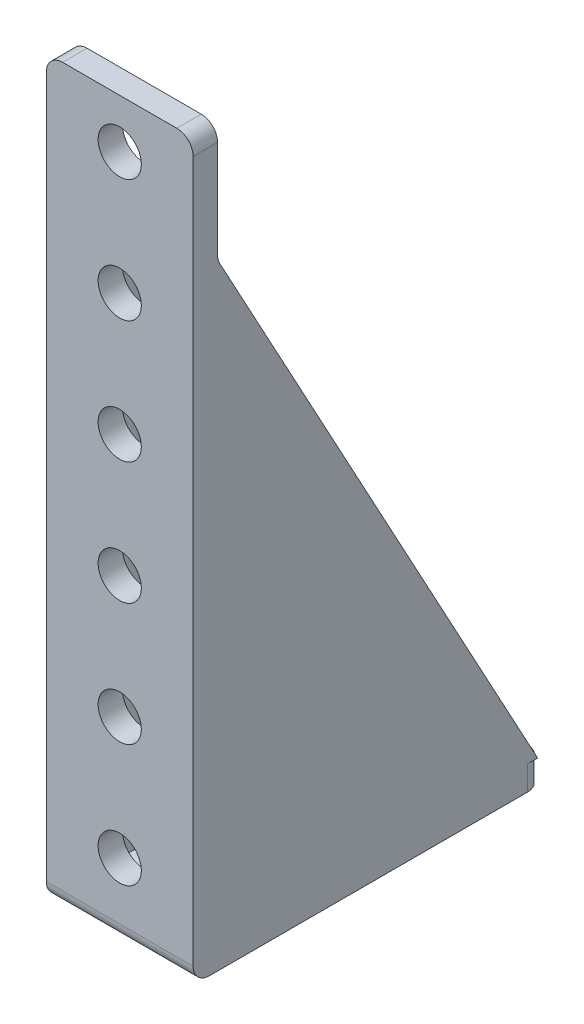
ISO-10303-21;
HEADER;
FILE_DESCRIPTION(('STEP AP214'),'2;1');
FILE_NAME('part.step','',(''),(''),'','','');
FILE_SCHEMA(('AUTOMOTIVE_DESIGN { 1 0 10303 214 1 1 1 1 }'));
ENDSEC;
DATA;
#1=APPLICATION_CONTEXT('core data for automotive mechanical design processes');
#2=APPLICATION_PROTOCOL_DEFINITION('international standard','automotive_design',2000,#1);
#3=PRODUCT_CONTEXT('',#1,'mechanical');
#4=PRODUCT('Part','Part','',(#3));
#5=PRODUCT_RELATED_PRODUCT_CATEGORY('part','',(#4));
#6=PRODUCT_DEFINITION_FORMATION('','',#4);
#7=PRODUCT_DEFINITION_CONTEXT('part definition',#1,'design');
#8=PRODUCT_DEFINITION('design','',#6,#7);
#9=PRODUCT_DEFINITION_SHAPE('','',#8);
#10=(LENGTH_UNIT() NAMED_UNIT(*) SI_UNIT(.MILLI.,.METRE.));
#11=(NAMED_UNIT(*) PLANE_ANGLE_UNIT() SI_UNIT($,.RADIAN.));
#12=(NAMED_UNIT(*) SI_UNIT($,.STERADIAN.) SOLID_ANGLE_UNIT());
#13=UNCERTAINTY_MEASURE_WITH_UNIT(LENGTH_MEASURE(1.E-05),#10,'distance_accuracy_value','');
#14=(GEOMETRIC_REPRESENTATION_CONTEXT(3) GLOBAL_UNCERTAINTY_ASSIGNED_CONTEXT((#13)) GLOBAL_UNIT_ASSIGNED_CONTEXT((#10,
#11,#12)) REPRESENTATION_CONTEXT('',''));
#15=CARTESIAN_POINT('',(0.,0.,0.));
#16=DIRECTION('',(0.,0.,1.));
#17=DIRECTION('',(1.,0.,0.));
#18=AXIS2_PLACEMENT_3D('',#15,#16,#17);
#19=CARTESIAN_POINT('',(0.,0.,0.));
#20=DIRECTION('',(0.,0.,1.));
#21=DIRECTION('',(1.,0.,0.));
#22=AXIS2_PLACEMENT_3D('',#19,#20,#21);
#23=PLANE('',#22);
#24=CARTESIAN_POINT('',(9.00000000000001,-81.,0.));
#25=DIRECTION('',(0.,0.,1.));
#26=DIRECTION('',(1.,0.,0.));
#27=AXIS2_PLACEMENT_3D('',#24,#25,#26);
#28=CIRCLE('',#27,2.65);
#29=CARTESIAN_POINT('',(11.65,-81.,0.));
#30=VERTEX_POINT('',#29);
#31=EDGE_CURVE('E283',#30,#30,#28,.T.);
#32=ORIENTED_EDGE('',*,*,#31,.T.);
#33=EDGE_LOOP('',(#32));
#34=FACE_BOUND('',#33,.T.);
#35=CARTESIAN_POINT('',(9.00000000000001,-66.,0.));
#36=DIRECTION('',(0.,0.,1.));
#37=DIRECTION('',(1.,0.,0.));
#38=AXIS2_PLACEMENT_3D('',#35,#36,#37);
#39=CIRCLE('',#38,2.65);
#40=CARTESIAN_POINT('',(11.65,-66.,0.));
#41=VERTEX_POINT('',#40);
#42=EDGE_CURVE('E294',#41,#41,#39,.T.);
#43=ORIENTED_EDGE('',*,*,#42,.T.);
#44=EDGE_LOOP('',(#43));
#45=FACE_BOUND('',#44,.T.);
#46=CARTESIAN_POINT('',(9.00000000000001,-51.,0.));
#47=DIRECTION('',(0.,0.,1.));
#48=DIRECTION('',(1.,0.,0.));
#49=AXIS2_PLACEMENT_3D('',#46,#47,#48);
#50=CIRCLE('',#49,2.65);
#51=CARTESIAN_POINT('',(11.65,-51.,0.));
#52=VERTEX_POINT('',#51);
#53=EDGE_CURVE('E296',#52,#52,#50,.T.);
#54=ORIENTED_EDGE('',*,*,#53,.T.);
#55=EDGE_LOOP('',(#54));
#56=FACE_BOUND('',#55,.T.);
#57=CARTESIAN_POINT('',(9.,-36.,0.));
#58=DIRECTION('',(0.,0.,1.));
#59=DIRECTION('',(1.,0.,0.));
#60=AXIS2_PLACEMENT_3D('',#57,#58,#59);
#61=CIRCLE('',#60,2.65);
#62=CARTESIAN_POINT('',(11.65,-36.,0.));
#63=VERTEX_POINT('',#62);
#64=EDGE_CURVE('E301',#63,#63,#61,.T.);
#65=ORIENTED_EDGE('',*,*,#64,.T.);
#66=EDGE_LOOP('',(#65));
#67=FACE_BOUND('',#66,.T.);
#68=CARTESIAN_POINT('',(9.,-21.,0.));
#69=DIRECTION('',(0.,0.,1.));
#70=DIRECTION('',(1.,0.,0.));
#71=AXIS2_PLACEMENT_3D('',#68,#69,#70);
#72=CIRCLE('',#71,2.65);
#73=CARTESIAN_POINT('',(11.65,-21.,0.));
#74=VERTEX_POINT('',#73);
#75=EDGE_CURVE('E309',#74,#74,#72,.T.);
#76=ORIENTED_EDGE('',*,*,#75,.T.);
#77=EDGE_LOOP('',(#76));
#78=FACE_BOUND('',#77,.T.);
#79=CARTESIAN_POINT('',(9.,-6.,0.));
#80=DIRECTION('',(0.,0.,1.));
#81=DIRECTION('',(1.,0.,0.));
#82=AXIS2_PLACEMENT_3D('',#79,#80,#81);
#83=CIRCLE('',#82,2.65);
#84=CARTESIAN_POINT('',(11.65,-6.,0.));
#85=VERTEX_POINT('',#84);
#86=EDGE_CURVE('E314',#85,#85,#83,.T.);
#87=ORIENTED_EDGE('',*,*,#86,.T.);
#88=EDGE_LOOP('',(#87));
#89=FACE_BOUND('',#88,.T.);
#90=DIRECTION('',(0.,1.,0.));
#91=VECTOR('',#90,1.);
#92=CARTESIAN_POINT('',(3.,-14.5,0.));
#93=LINE('',#92,#91);
#94=CARTESIAN_POINT('',(3.00000000000001,-87.,0.));
#95=VERTEX_POINT('',#94);
#96=CARTESIAN_POINT('',(3.,-13.9933455949089,0.));
#97=VERTEX_POINT('',#96);
#98=EDGE_CURVE('E65',#95,#97,#93,.T.);
#99=ORIENTED_EDGE('',*,*,#98,.T.);
#100=DIRECTION('',(-1.,0.,0.));
#101=VECTOR('',#100,1.);
#102=CARTESIAN_POINT('',(0.,-13.993345594909,0.));
#103=LINE('',#102,#101);
#104=CARTESIAN_POINT('',(0.,-13.9933455949089,0.));
#105=VERTEX_POINT('',#104);
#106=EDGE_CURVE('E404',#97,#105,#103,.T.);
#107=ORIENTED_EDGE('',*,*,#106,.T.);
#108=DIRECTION('',(0.,-1.,0.));
#109=VECTOR('',#108,1.);
#110=CARTESIAN_POINT('',(0.,0.,0.));
#111=LINE('',#110,#109);
#112=CARTESIAN_POINT('',(0.,-2.,0.));
#113=VERTEX_POINT('',#112);
#114=EDGE_CURVE('E324',#113,#105,#111,.T.);
#115=ORIENTED_EDGE('',*,*,#114,.F.);
#116=CARTESIAN_POINT('',(2.,-2.,0.));
#117=DIRECTION('',(0.,0.,1.));
#118=DIRECTION('',(1.,0.,0.));
#119=AXIS2_PLACEMENT_3D('',#116,#117,#118);
#120=CIRCLE('',#119,2.);
#121=CARTESIAN_POINT('',(2.,0.,0.));
#122=VERTEX_POINT('',#121);
#123=EDGE_CURVE('E367',#113,#122,#120,.F.);
#124=ORIENTED_EDGE('',*,*,#123,.T.);
#125=DIRECTION('',(-1.,0.,0.));
#126=VECTOR('',#125,1.);
#127=CARTESIAN_POINT('',(0.,0.,0.));
#128=LINE('',#127,#126);
#129=CARTESIAN_POINT('',(16.,0.,0.));
#130=VERTEX_POINT('',#129);
#131=EDGE_CURVE('E326',#130,#122,#128,.T.);
#132=ORIENTED_EDGE('',*,*,#131,.F.);
#133=CARTESIAN_POINT('',(16.,-2.,0.));
#134=DIRECTION('',(0.,0.,1.));
#135=DIRECTION('',(1.,0.,0.));
#136=AXIS2_PLACEMENT_3D('',#133,#134,#135);
#137=CIRCLE('',#136,2.);
#138=CARTESIAN_POINT('',(18.,-2.,0.));
#139=VERTEX_POINT('',#138);
#140=EDGE_CURVE('E366',#130,#139,#137,.F.);
#141=ORIENTED_EDGE('',*,*,#140,.T.);
#142=DIRECTION('',(0.,1.,0.));
#143=VECTOR('',#142,1.);
#144=CARTESIAN_POINT('',(18.,0.,0.));
#145=LINE('',#144,#143);
#146=CARTESIAN_POINT('',(18.,-13.9933455949089,0.));
#147=VERTEX_POINT('',#146);
#148=EDGE_CURVE('E338',#147,#139,#145,.T.);
#149=ORIENTED_EDGE('',*,*,#148,.F.);
#150=DIRECTION('',(1.,0.,0.));
#151=VECTOR('',#150,1.);
#152=CARTESIAN_POINT('',(0.,-13.9933455949089,0.));
#153=LINE('',#152,#151);
#154=CARTESIAN_POINT('',(15.,-13.9933455949089,0.));
#155=VERTEX_POINT('',#154);
#156=EDGE_CURVE('E403',#147,#155,#153,.F.);
#157=ORIENTED_EDGE('',*,*,#156,.T.);
#158=DIRECTION('',(0.,-1.,0.));
#159=VECTOR('',#158,1.);
#160=CARTESIAN_POINT('',(15.,-87.,0.));
#161=LINE('',#160,#159);
#162=CARTESIAN_POINT('',(15.,-87.,0.));
#163=VERTEX_POINT('',#162);
#164=EDGE_CURVE('E223',#155,#163,#161,.T.);
#165=ORIENTED_EDGE('',*,*,#164,.T.);
#166=DIRECTION('',(-1.,0.,0.));
#167=VECTOR('',#166,1.);
#168=CARTESIAN_POINT('',(0.,-87.,0.));
#169=LINE('',#168,#167);
#170=EDGE_CURVE('E282',#163,#95,#169,.T.);
#171=ORIENTED_EDGE('',*,*,#170,.T.);
#172=EDGE_LOOP('',(#99,#107,#115,#124,#132,#141,#149,#157,#165,#171));
#173=FACE_BOUND('',#172,.T.);
#174=ADVANCED_FACE('F39',(#34,#45,#56,#67,#78,#89,#173),#23,.F.);
#175=CARTESIAN_POINT('',(0.,-87.,0.));
#176=DIRECTION('',(0.,-1.,0.));
#177=DIRECTION('',(0.,0.,-1.));
#178=AXIS2_PLACEMENT_3D('',#175,#176,#177);
#179=PLANE('',#178);
#180=DIRECTION('',(0.,0.,1.));
#181=VECTOR('',#180,1.);
#182=CARTESIAN_POINT('',(10.6,-87.,-6.02510414656997));
#183=LINE('',#182,#181);
#184=CARTESIAN_POINT('',(10.6,-87.,-36.02510414657));
#185=VERTEX_POINT('',#184);
#186=CARTESIAN_POINT('',(10.6,-87.,-6.02510414656997));
#187=VERTEX_POINT('',#186);
#188=EDGE_CURVE('E258',#185,#187,#183,.T.);
#189=ORIENTED_EDGE('',*,*,#188,.T.);
#190=CARTESIAN_POINT('',(8.99999999999999,-87.,-6.02510414656997));
#191=DIRECTION('',(0.,-1.,0.));
#192=DIRECTION('',(0.,0.,-1.));
#193=AXIS2_PLACEMENT_3D('',#190,#191,#192);
#194=CIRCLE('',#193,1.6);
#195=CARTESIAN_POINT('',(7.39999999999999,-87.,-6.02510414656997));
#196=VERTEX_POINT('',#195);
#197=EDGE_CURVE('E249',#187,#196,#194,.T.);
#198=ORIENTED_EDGE('',*,*,#197,.T.);
#199=DIRECTION('',(0.,0.,-1.));
#200=VECTOR('',#199,1.);
#201=CARTESIAN_POINT('',(7.39999999999999,-87.,-6.02510414656997));
#202=LINE('',#201,#200);
#203=CARTESIAN_POINT('',(7.39999999999999,-87.,-36.02510414657));
#204=VERTEX_POINT('',#203);
#205=EDGE_CURVE('E248',#196,#204,#202,.T.);
#206=ORIENTED_EDGE('',*,*,#205,.T.);
#207=CARTESIAN_POINT('',(8.99999999999999,-87.,-36.02510414657));
#208=DIRECTION('',(0.,-1.,0.));
#209=DIRECTION('',(0.,0.,-1.));
#210=AXIS2_PLACEMENT_3D('',#207,#208,#209);
#211=CIRCLE('',#210,1.6);
#212=EDGE_CURVE('E251',#204,#185,#211,.T.);
#213=ORIENTED_EDGE('',*,*,#212,.T.);
#214=EDGE_LOOP('',(#189,#198,#206,#213));
#215=FACE_BOUND('',#214,.T.);
#216=DIRECTION('',(0.,0.,-1.));
#217=VECTOR('',#216,1.);
#218=CARTESIAN_POINT('',(15.,-87.,-39.2513893911399));
#219=LINE('',#218,#217);
#220=CARTESIAN_POINT('',(15.,-87.,-40.));
#221=VERTEX_POINT('',#220);
#222=EDGE_CURVE('E230',#163,#221,#219,.T.);
#223=ORIENTED_EDGE('',*,*,#222,.T.);
#224=DIRECTION('',(1.,0.,0.));
#225=VECTOR('',#224,1.);
#226=CARTESIAN_POINT('',(0.,-87.,-40.));
#227=LINE('',#226,#225);
#228=CARTESIAN_POINT('',(3.00000000000001,-87.,-40.));
#229=VERTEX_POINT('',#228);
#230=EDGE_CURVE('E285',#229,#221,#227,.T.);
#231=ORIENTED_EDGE('',*,*,#230,.F.);
#232=DIRECTION('',(0.,0.,1.));
#233=VECTOR('',#232,1.);
#234=CARTESIAN_POINT('',(3.00000000000001,-87.,0.));
#235=LINE('',#234,#233);
#236=EDGE_CURVE('E236',#229,#95,#235,.T.);
#237=ORIENTED_EDGE('',*,*,#236,.T.);
#238=ORIENTED_EDGE('',*,*,#170,.F.);
#239=EDGE_LOOP('',(#223,#231,#237,#238));
#240=FACE_BOUND('',#239,.T.);
#241=ADVANCED_FACE('F457',(#215,#240),#179,.F.);
#242=CARTESIAN_POINT('',(0.,0.,3.));
#243=DIRECTION('',(0.,0.,1.));
#244=DIRECTION('',(1.,0.,0.));
#245=AXIS2_PLACEMENT_3D('',#242,#243,#244);
#246=PLANE('',#245);
#247=CARTESIAN_POINT('',(9.00000000000001,-66.,3.));
#248=DIRECTION('',(0.,0.,1.));
#249=DIRECTION('',(1.,0.,0.));
#250=AXIS2_PLACEMENT_3D('',#247,#248,#249);
#251=CIRCLE('',#250,2.65);
#252=CARTESIAN_POINT('',(11.65,-66.,3.));
#253=VERTEX_POINT('',#252);
#254=EDGE_CURVE('E293',#253,#253,#251,.T.);
#255=ORIENTED_EDGE('',*,*,#254,.F.);
#256=EDGE_LOOP('',(#255));
#257=FACE_BOUND('',#256,.T.);
#258=CARTESIAN_POINT('',(9.,-36.,3.));
#259=DIRECTION('',(0.,0.,1.));
#260=DIRECTION('',(1.,0.,0.));
#261=AXIS2_PLACEMENT_3D('',#258,#259,#260);
#262=CIRCLE('',#261,2.65);
#263=CARTESIAN_POINT('',(11.65,-36.,3.));
#264=VERTEX_POINT('',#263);
#265=EDGE_CURVE('E307',#264,#264,#262,.T.);
#266=ORIENTED_EDGE('',*,*,#265,.F.);
#267=EDGE_LOOP('',(#266));
#268=FACE_BOUND('',#267,.T.);
#269=CARTESIAN_POINT('',(9.,-6.,3.));
#270=DIRECTION('',(0.,0.,1.));
#271=DIRECTION('',(1.,0.,0.));
#272=AXIS2_PLACEMENT_3D('',#269,#270,#271);
#273=CIRCLE('',#272,2.65);
#274=CARTESIAN_POINT('',(11.65,-6.,3.));
#275=VERTEX_POINT('',#274);
#276=EDGE_CURVE('E320',#275,#275,#273,.T.);
#277=ORIENTED_EDGE('',*,*,#276,.F.);
#278=EDGE_LOOP('',(#277));
#279=FACE_BOUND('',#278,.T.);
#280=DIRECTION('',(0.,-1.,0.));
#281=VECTOR('',#280,1.);
#282=CARTESIAN_POINT('',(0.,0.,3.));
#283=LINE('',#282,#281);
#284=CARTESIAN_POINT('',(0.,-2.,3.));
#285=VERTEX_POINT('',#284);
#286=CARTESIAN_POINT('',(0.,-88.,3.));
#287=VERTEX_POINT('',#286);
#288=EDGE_CURVE('E323',#285,#287,#283,.T.);
#289=ORIENTED_EDGE('',*,*,#288,.T.);
#290=DIRECTION('',(1.,0.,0.));
#291=VECTOR('',#290,1.);
#292=CARTESIAN_POINT('',(18.,-88.,3.));
#293=LINE('',#292,#291);
#294=CARTESIAN_POINT('',(18.,-88.,3.));
#295=VERTEX_POINT('',#294);
#296=EDGE_CURVE('E382',#287,#295,#293,.T.);
#297=ORIENTED_EDGE('',*,*,#296,.T.);
#298=DIRECTION('',(0.,1.,0.));
#299=VECTOR('',#298,1.);
#300=CARTESIAN_POINT('',(18.,0.,3.));
#301=LINE('',#300,#299);
#302=CARTESIAN_POINT('',(18.,-2.,3.));
#303=VERTEX_POINT('',#302);
#304=EDGE_CURVE('E330',#295,#303,#301,.T.);
#305=ORIENTED_EDGE('',*,*,#304,.T.);
#306=CARTESIAN_POINT('',(16.,-2.,3.));
#307=DIRECTION('',(0.,0.,1.));
#308=DIRECTION('',(1.,0.,0.));
#309=AXIS2_PLACEMENT_3D('',#306,#307,#308);
#310=CIRCLE('',#309,2.);
#311=CARTESIAN_POINT('',(16.,0.,3.));
#312=VERTEX_POINT('',#311);
#313=EDGE_CURVE('E380',#303,#312,#310,.T.);
#314=ORIENTED_EDGE('',*,*,#313,.T.);
#315=DIRECTION('',(-1.,0.,0.));
#316=VECTOR('',#315,1.);
#317=CARTESIAN_POINT('',(0.,0.,3.));
#318=LINE('',#317,#316);
#319=CARTESIAN_POINT('',(2.,0.,3.));
#320=VERTEX_POINT('',#319);
#321=EDGE_CURVE('E327',#312,#320,#318,.T.);
#322=ORIENTED_EDGE('',*,*,#321,.T.);
#323=CARTESIAN_POINT('',(2.,-2.,3.));
#324=DIRECTION('',(0.,0.,1.));
#325=DIRECTION('',(1.,0.,0.));
#326=AXIS2_PLACEMENT_3D('',#323,#324,#325);
#327=CIRCLE('',#326,2.);
#328=EDGE_CURVE('E379',#320,#285,#327,.T.);
#329=ORIENTED_EDGE('',*,*,#328,.T.);
#330=EDGE_LOOP('',(#289,#297,#305,#314,#322,#329));
#331=FACE_BOUND('',#330,.T.);
#332=CARTESIAN_POINT('',(9.,-21.,3.));
#333=DIRECTION('',(0.,0.,1.));
#334=DIRECTION('',(1.,0.,0.));
#335=AXIS2_PLACEMENT_3D('',#332,#333,#334);
#336=CIRCLE('',#335,2.65);
#337=CARTESIAN_POINT('',(11.65,-21.,3.));
#338=VERTEX_POINT('',#337);
#339=EDGE_CURVE('E315',#338,#338,#336,.T.);
#340=ORIENTED_EDGE('',*,*,#339,.F.);
#341=EDGE_LOOP('',(#340));
#342=FACE_BOUND('',#341,.T.);
#343=CARTESIAN_POINT('',(9.00000000000001,-51.,3.));
#344=DIRECTION('',(0.,0.,1.));
#345=DIRECTION('',(1.,0.,0.));
#346=AXIS2_PLACEMENT_3D('',#343,#344,#345);
#347=CIRCLE('',#346,2.65);
#348=CARTESIAN_POINT('',(11.65,-51.,3.));
#349=VERTEX_POINT('',#348);
#350=EDGE_CURVE('E297',#349,#349,#347,.T.);
#351=ORIENTED_EDGE('',*,*,#350,.F.);
#352=EDGE_LOOP('',(#351));
#353=FACE_BOUND('',#352,.T.);
#354=CARTESIAN_POINT('',(9.00000000000001,-81.,3.));
#355=DIRECTION('',(0.,0.,1.));
#356=DIRECTION('',(1.,0.,0.));
#357=AXIS2_PLACEMENT_3D('',#354,#355,#356);
#358=CIRCLE('',#357,2.65);
#359=CARTESIAN_POINT('',(11.65,-81.,3.));
#360=VERTEX_POINT('',#359);
#361=EDGE_CURVE('E287',#360,#360,#358,.T.);
#362=ORIENTED_EDGE('',*,*,#361,.F.);
#363=EDGE_LOOP('',(#362));
#364=FACE_BOUND('',#363,.T.);
#365=ADVANCED_FACE('F462',(#257,#268,#279,#331,#342,#353,#364),#246,.T.);
#366=CARTESIAN_POINT('',(0.,0.,3.));
#367=DIRECTION('',(1.,0.,0.));
#368=DIRECTION('',(0.,1.,0.));
#369=AXIS2_PLACEMENT_3D('',#366,#367,#368);
#370=PLANE('',#369);
#371=DIRECTION('',(0.,0.,-1.));
#372=VECTOR('',#371,1.);
#373=CARTESIAN_POINT('',(0.,-90.,3.));
#374=LINE('',#373,#372);
#375=CARTESIAN_POINT('',(0.,-90.,1.));
#376=VERTEX_POINT('',#375);
#377=CARTESIAN_POINT('',(0.,-90.,-38.));
#378=VERTEX_POINT('',#377);
#379=EDGE_CURVE('E341',#376,#378,#374,.T.);
#380=ORIENTED_EDGE('',*,*,#379,.F.);
#381=CARTESIAN_POINT('',(0.,-88.,1.));
#382=DIRECTION('',(1.,0.,0.));
#383=DIRECTION('',(0.,1.,0.));
#384=AXIS2_PLACEMENT_3D('',#381,#382,#383);
#385=CIRCLE('',#384,2.);
#386=EDGE_CURVE('E387',#376,#287,#385,.F.);
#387=ORIENTED_EDGE('',*,*,#386,.T.);
#388=ORIENTED_EDGE('',*,*,#288,.F.);
#389=DIRECTION('',(0.,0.,-1.));
#390=VECTOR('',#389,1.);
#391=CARTESIAN_POINT('',(0.,-2.,3.));
#392=LINE('',#391,#390);
#393=EDGE_CURVE('E361',#285,#113,#392,.T.);
#394=ORIENTED_EDGE('',*,*,#393,.T.);
#395=ORIENTED_EDGE('',*,*,#114,.T.);
#396=CARTESIAN_POINT('',(0.,-13.993345594909,-2.));
#397=DIRECTION('',(1.,0.,0.));
#398=DIRECTION('',(0.,1.,0.));
#399=AXIS2_PLACEMENT_3D('',#396,#397,#398);
#400=CIRCLE('',#399,2.);
#401=CARTESIAN_POINT('',(0.,-14.9455471810514,-0.241218564076873));
#402=VERTEX_POINT('',#401);
#403=EDGE_CURVE('E588',#105,#402,#400,.T.);
#404=ORIENTED_EDGE('',*,*,#403,.T.);
#405=DIRECTION('',(0.,-0.879390717961564,-0.47610079307122));
#406=VECTOR('',#405,1.);
#407=CARTESIAN_POINT('',(0.,-14.5,0.));
#408=LINE('',#407,#406);
#409=CARTESIAN_POINT('',(0.,-87.,-39.2513893911399));
#410=VERTEX_POINT('',#409);
#411=EDGE_CURVE('E209',#402,#410,#408,.T.);
#412=ORIENTED_EDGE('',*,*,#411,.T.);
#413=DIRECTION('',(0.,0.,1.));
#414=VECTOR('',#413,1.);
#415=CARTESIAN_POINT('',(0.,-87.,0.));
#416=LINE('',#415,#414);
#417=CARTESIAN_POINT('',(0.,-87.,-38.));
#418=VERTEX_POINT('',#417);
#419=EDGE_CURVE('E231',#410,#418,#416,.T.);
#420=ORIENTED_EDGE('',*,*,#419,.T.);
#421=DIRECTION('',(0.,-1.,0.));
#422=VECTOR('',#421,1.);
#423=CARTESIAN_POINT('',(0.,-90.,-38.));
#424=LINE('',#423,#422);
#425=EDGE_CURVE('E363',#418,#378,#424,.T.);
#426=ORIENTED_EDGE('',*,*,#425,.T.);
#427=EDGE_LOOP('',(#380,#387,#388,#394,#395,#404,#412,#420,#426));
#428=FACE_BOUND('',#427,.T.);
#429=ADVANCED_FACE('F430',(#428),#370,.F.);
#430=CARTESIAN_POINT('',(0.,-90.,3.));
#431=DIRECTION('',(0.,1.,0.));
#432=DIRECTION('',(0.,0.,1.));
#433=AXIS2_PLACEMENT_3D('',#430,#431,#432);
#434=PLANE('',#433);
#435=DIRECTION('',(0.,0.,-1.));
#436=VECTOR('',#435,1.);
#437=CARTESIAN_POINT('',(18.,-90.,3.));
#438=LINE('',#437,#436);
#439=CARTESIAN_POINT('',(18.,-90.,1.));
#440=VERTEX_POINT('',#439);
#441=CARTESIAN_POINT('',(18.,-90.,-38.));
#442=VERTEX_POINT('',#441);
#443=EDGE_CURVE('E331',#440,#442,#438,.T.);
#444=ORIENTED_EDGE('',*,*,#443,.F.);
#445=DIRECTION('',(1.,0.,0.));
#446=VECTOR('',#445,1.);
#447=CARTESIAN_POINT('',(0.,-90.,1.));
#448=LINE('',#447,#446);
#449=EDGE_CURVE('E386',#440,#376,#448,.F.);
#450=ORIENTED_EDGE('',*,*,#449,.T.);
#451=ORIENTED_EDGE('',*,*,#379,.T.);
#452=CARTESIAN_POINT('',(2.00000000000001,-90.,-38.));
#453=DIRECTION('',(0.,1.,0.));
#454=DIRECTION('',(0.,0.,1.));
#455=AXIS2_PLACEMENT_3D('',#452,#453,#454);
#456=CIRCLE('',#455,2.);
#457=CARTESIAN_POINT('',(2.00000000000001,-90.,-40.));
#458=VERTEX_POINT('',#457);
#459=EDGE_CURVE('E347',#378,#458,#456,.F.);
#460=ORIENTED_EDGE('',*,*,#459,.T.);
#461=DIRECTION('',(1.,0.,0.));
#462=VECTOR('',#461,1.);
#463=CARTESIAN_POINT('',(0.,-90.,-40.));
#464=LINE('',#463,#462);
#465=CARTESIAN_POINT('',(16.,-90.,-40.));
#466=VERTEX_POINT('',#465);
#467=EDGE_CURVE('E271',#458,#466,#464,.T.);
#468=ORIENTED_EDGE('',*,*,#467,.T.);
#469=CARTESIAN_POINT('',(16.,-90.,-38.));
#470=DIRECTION('',(0.,1.,0.));
#471=DIRECTION('',(0.,0.,1.));
#472=AXIS2_PLACEMENT_3D('',#469,#470,#471);
#473=CIRCLE('',#472,2.);
#474=EDGE_CURVE('E351',#466,#442,#473,.F.);
#475=ORIENTED_EDGE('',*,*,#474,.T.);
#476=EDGE_LOOP('',(#444,#450,#451,#460,#468,#475));
#477=FACE_BOUND('',#476,.T.);
#478=CARTESIAN_POINT('',(8.99999999999999,-90.,-6.02510414656997));
#479=DIRECTION('',(0.,-1.,0.));
#480=DIRECTION('',(0.,0.,-1.));
#481=AXIS2_PLACEMENT_3D('',#478,#479,#480);
#482=CIRCLE('',#481,1.6);
#483=CARTESIAN_POINT('',(10.6,-90.,-6.02510414656997));
#484=VERTEX_POINT('',#483);
#485=CARTESIAN_POINT('',(7.39999999999999,-90.,-6.02510414656997));
#486=VERTEX_POINT('',#485);
#487=EDGE_CURVE('E242',#484,#486,#482,.T.);
#488=ORIENTED_EDGE('',*,*,#487,.F.);
#489=DIRECTION('',(0.,0.,1.));
#490=VECTOR('',#489,1.);
#491=CARTESIAN_POINT('',(10.6,-90.,-6.02510414656997));
#492=LINE('',#491,#490);
#493=CARTESIAN_POINT('',(10.6,-90.,-36.02510414657));
#494=VERTEX_POINT('',#493);
#495=EDGE_CURVE('E247',#494,#484,#492,.T.);
#496=ORIENTED_EDGE('',*,*,#495,.F.);
#497=CARTESIAN_POINT('',(8.99999999999999,-90.,-36.02510414657));
#498=DIRECTION('',(0.,-1.,0.));
#499=DIRECTION('',(0.,0.,-1.));
#500=AXIS2_PLACEMENT_3D('',#497,#498,#499);
#501=CIRCLE('',#500,1.6);
#502=CARTESIAN_POINT('',(7.39999999999999,-90.,-36.02510414657));
#503=VERTEX_POINT('',#502);
#504=EDGE_CURVE('E264',#503,#494,#501,.T.);
#505=ORIENTED_EDGE('',*,*,#504,.F.);
#506=DIRECTION('',(0.,0.,-1.));
#507=VECTOR('',#506,1.);
#508=CARTESIAN_POINT('',(7.39999999999999,-90.,-6.02510414656997));
#509=LINE('',#508,#507);
#510=EDGE_CURVE('E263',#486,#503,#509,.T.);
#511=ORIENTED_EDGE('',*,*,#510,.F.);
#512=EDGE_LOOP('',(#488,#496,#505,#511));
#513=FACE_BOUND('',#512,.T.);
#514=ADVANCED_FACE('F478',(#477,#513),#434,.F.);
#515=CARTESIAN_POINT('',(18.,0.,3.));
#516=DIRECTION('',(-1.,0.,0.));
#517=DIRECTION('',(0.,-1.,0.));
#518=AXIS2_PLACEMENT_3D('',#515,#516,#517);
#519=PLANE('',#518);
#520=ORIENTED_EDGE('',*,*,#304,.F.);
#521=CARTESIAN_POINT('',(18.,-88.,1.));
#522=DIRECTION('',(-1.,0.,0.));
#523=DIRECTION('',(0.,-1.,0.));
#524=AXIS2_PLACEMENT_3D('',#521,#522,#523);
#525=CIRCLE('',#524,2.);
#526=EDGE_CURVE('E384',#295,#440,#525,.F.);
#527=ORIENTED_EDGE('',*,*,#526,.T.);
#528=ORIENTED_EDGE('',*,*,#443,.T.);
#529=DIRECTION('',(0.,-1.,0.));
#530=VECTOR('',#529,1.);
#531=CARTESIAN_POINT('',(18.,-87.,-38.));
#532=LINE('',#531,#530);
#533=CARTESIAN_POINT('',(18.,-87.,-38.));
#534=VERTEX_POINT('',#533);
#535=EDGE_CURVE('E216',#442,#534,#532,.F.);
#536=ORIENTED_EDGE('',*,*,#535,.T.);
#537=DIRECTION('',(0.,0.,-1.));
#538=VECTOR('',#537,1.);
#539=CARTESIAN_POINT('',(18.,-87.,-39.2513893911399));
#540=LINE('',#539,#538);
#541=CARTESIAN_POINT('',(18.,-87.,-39.2513893911399));
#542=VERTEX_POINT('',#541);
#543=EDGE_CURVE('E202',#534,#542,#540,.T.);
#544=ORIENTED_EDGE('',*,*,#543,.T.);
#545=DIRECTION('',(0.,0.879390717961564,0.47610079307122));
#546=VECTOR('',#545,1.);
#547=CARTESIAN_POINT('',(18.,-14.5,0.));
#548=LINE('',#547,#546);
#549=CARTESIAN_POINT('',(18.,-14.9455471810514,-0.241218564076872));
#550=VERTEX_POINT('',#549);
#551=EDGE_CURVE('E214',#542,#550,#548,.T.);
#552=ORIENTED_EDGE('',*,*,#551,.T.);
#553=CARTESIAN_POINT('',(18.,-13.9933455949089,-2.));
#554=DIRECTION('',(-1.,0.,0.));
#555=DIRECTION('',(0.,-1.,0.));
#556=AXIS2_PLACEMENT_3D('',#553,#554,#555);
#557=CIRCLE('',#556,2.);
#558=EDGE_CURVE('E50',#550,#147,#557,.T.);
#559=ORIENTED_EDGE('',*,*,#558,.T.);
#560=ORIENTED_EDGE('',*,*,#148,.T.);
#561=DIRECTION('',(0.,0.,-1.));
#562=VECTOR('',#561,1.);
#563=CARTESIAN_POINT('',(18.,-2.,3.));
#564=LINE('',#563,#562);
#565=EDGE_CURVE('E353',#139,#303,#564,.F.);
#566=ORIENTED_EDGE('',*,*,#565,.T.);
#567=EDGE_LOOP('',(#520,#527,#528,#536,#544,#552,#559,#560,#566));
#568=FACE_BOUND('',#567,.T.);
#569=ADVANCED_FACE('F213',(#568),#519,.F.);
#570=CARTESIAN_POINT('',(0.,0.,3.));
#571=DIRECTION('',(0.,-1.,0.));
#572=DIRECTION('',(0.,0.,-1.));
#573=AXIS2_PLACEMENT_3D('',#570,#571,#572);
#574=PLANE('',#573);
#575=ORIENTED_EDGE('',*,*,#131,.T.);
#576=DIRECTION('',(0.,0.,-1.));
#577=VECTOR('',#576,1.);
#578=CARTESIAN_POINT('',(2.,0.,3.));
#579=LINE('',#578,#577);
#580=EDGE_CURVE('E372',#122,#320,#579,.F.);
#581=ORIENTED_EDGE('',*,*,#580,.T.);
#582=ORIENTED_EDGE('',*,*,#321,.F.);
#583=DIRECTION('',(0.,0.,-1.));
#584=VECTOR('',#583,1.);
#585=CARTESIAN_POINT('',(16.,0.,3.));
#586=LINE('',#585,#584);
#587=EDGE_CURVE('E371',#312,#130,#586,.T.);
#588=ORIENTED_EDGE('',*,*,#587,.T.);
#589=EDGE_LOOP('',(#575,#581,#582,#588));
#590=FACE_BOUND('',#589,.T.);
#591=ADVANCED_FACE('F467',(#590),#574,.F.);
#592=CARTESIAN_POINT('',(9.,-6.,3.));
#593=DIRECTION('',(0.,0.,-1.));
#594=DIRECTION('',(-1.,0.,0.));
#595=AXIS2_PLACEMENT_3D('',#592,#593,#594);
#596=CYLINDRICAL_SURFACE('',#595,2.65);
#597=ORIENTED_EDGE('',*,*,#276,.T.);
#598=EDGE_LOOP('',(#597));
#599=FACE_BOUND('',#598,.T.);
#600=ORIENTED_EDGE('',*,*,#86,.F.);
#601=EDGE_LOOP('',(#600));
#602=FACE_BOUND('',#601,.T.);
#603=ADVANCED_FACE('F475',(#599,#602),#596,.F.);
#604=CARTESIAN_POINT('',(9.,-21.,3.));
#605=DIRECTION('',(0.,0.,-1.));
#606=DIRECTION('',(-1.,0.,0.));
#607=AXIS2_PLACEMENT_3D('',#604,#605,#606);
#608=CYLINDRICAL_SURFACE('',#607,2.65);
#609=ORIENTED_EDGE('',*,*,#339,.T.);
#610=EDGE_LOOP('',(#609));
#611=FACE_BOUND('',#610,.T.);
#612=ORIENTED_EDGE('',*,*,#75,.F.);
#613=EDGE_LOOP('',(#612));
#614=FACE_BOUND('',#613,.T.);
#615=ADVANCED_FACE('F531',(#611,#614),#608,.F.);
#616=CARTESIAN_POINT('',(9.,-36.,3.));
#617=DIRECTION('',(0.,0.,-1.));
#618=DIRECTION('',(-1.,0.,0.));
#619=AXIS2_PLACEMENT_3D('',#616,#617,#618);
#620=CYLINDRICAL_SURFACE('',#619,2.65);
#621=ORIENTED_EDGE('',*,*,#265,.T.);
#622=EDGE_LOOP('',(#621));
#623=FACE_BOUND('',#622,.T.);
#624=ORIENTED_EDGE('',*,*,#64,.F.);
#625=EDGE_LOOP('',(#624));
#626=FACE_BOUND('',#625,.T.);
#627=ADVANCED_FACE('F529',(#623,#626),#620,.F.);
#628=CARTESIAN_POINT('',(9.00000000000001,-51.,3.));
#629=DIRECTION('',(0.,0.,-1.));
#630=DIRECTION('',(-1.,0.,0.));
#631=AXIS2_PLACEMENT_3D('',#628,#629,#630);
#632=CYLINDRICAL_SURFACE('',#631,2.65);
#633=ORIENTED_EDGE('',*,*,#350,.T.);
#634=EDGE_LOOP('',(#633));
#635=FACE_BOUND('',#634,.T.);
#636=ORIENTED_EDGE('',*,*,#53,.F.);
#637=EDGE_LOOP('',(#636));
#638=FACE_BOUND('',#637,.T.);
#639=ADVANCED_FACE('F522',(#635,#638),#632,.F.);
#640=CARTESIAN_POINT('',(9.00000000000001,-66.,3.));
#641=DIRECTION('',(0.,0.,-1.));
#642=DIRECTION('',(-1.,0.,0.));
#643=AXIS2_PLACEMENT_3D('',#640,#641,#642);
#644=CYLINDRICAL_SURFACE('',#643,2.65);
#645=ORIENTED_EDGE('',*,*,#254,.T.);
#646=EDGE_LOOP('',(#645));
#647=FACE_BOUND('',#646,.T.);
#648=ORIENTED_EDGE('',*,*,#42,.F.);
#649=EDGE_LOOP('',(#648));
#650=FACE_BOUND('',#649,.T.);
#651=ADVANCED_FACE('F524',(#647,#650),#644,.F.);
#652=CARTESIAN_POINT('',(9.00000000000001,-81.,3.));
#653=DIRECTION('',(0.,0.,-1.));
#654=DIRECTION('',(-1.,0.,0.));
#655=AXIS2_PLACEMENT_3D('',#652,#653,#654);
#656=CYLINDRICAL_SURFACE('',#655,2.65);
#657=ORIENTED_EDGE('',*,*,#361,.T.);
#658=EDGE_LOOP('',(#657));
#659=FACE_BOUND('',#658,.T.);
#660=ORIENTED_EDGE('',*,*,#31,.F.);
#661=EDGE_LOOP('',(#660));
#662=FACE_BOUND('',#661,.T.);
#663=ADVANCED_FACE('F516',(#659,#662),#656,.F.);
#664=CARTESIAN_POINT('',(0.,-87.,-40.));
#665=DIRECTION('',(0.,0.,-1.));
#666=DIRECTION('',(-1.,0.,0.));
#667=AXIS2_PLACEMENT_3D('',#664,#665,#666);
#668=PLANE('',#667);
#669=CARTESIAN_POINT('',(2.00000000000001,-87.,-40.));
#670=VERTEX_POINT('',#669);
#671=EDGE_CURVE('E277',#670,#229,#227,.T.);
#672=ORIENTED_EDGE('',*,*,#671,.T.);
#673=ORIENTED_EDGE('',*,*,#230,.T.);
#674=CARTESIAN_POINT('',(16.,-87.,-40.));
#675=VERTEX_POINT('',#674);
#676=EDGE_CURVE('E284',#221,#675,#227,.T.);
#677=ORIENTED_EDGE('',*,*,#676,.T.);
#678=DIRECTION('',(0.,-1.,0.));
#679=VECTOR('',#678,1.);
#680=CARTESIAN_POINT('',(16.,-90.,-40.));
#681=LINE('',#680,#679);
#682=EDGE_CURVE('E346',#675,#466,#681,.T.);
#683=ORIENTED_EDGE('',*,*,#682,.T.);
#684=ORIENTED_EDGE('',*,*,#467,.F.);
#685=DIRECTION('',(0.,-1.,0.));
#686=VECTOR('',#685,1.);
#687=CARTESIAN_POINT('',(2.00000000000001,-87.,-40.));
#688=LINE('',#687,#686);
#689=EDGE_CURVE('E343',#458,#670,#688,.F.);
#690=ORIENTED_EDGE('',*,*,#689,.T.);
#691=EDGE_LOOP('',(#672,#673,#677,#683,#684,#690));
#692=FACE_BOUND('',#691,.T.);
#693=ADVANCED_FACE('F512',(#692),#668,.T.);
#694=CARTESIAN_POINT('',(8.99999999999999,-87.,-6.02510414656997));
#695=DIRECTION('',(0.,-1.,0.));
#696=DIRECTION('',(0.,0.,-1.));
#697=AXIS2_PLACEMENT_3D('',#694,#695,#696);
#698=CYLINDRICAL_SURFACE('',#697,1.6);
#699=ORIENTED_EDGE('',*,*,#487,.T.);
#700=DIRECTION('',(0.,-1.,0.));
#701=VECTOR('',#700,1.);
#702=CARTESIAN_POINT('',(7.39999999999999,-87.,-6.02510414656997));
#703=LINE('',#702,#701);
#704=EDGE_CURVE('E260',#196,#486,#703,.T.);
#705=ORIENTED_EDGE('',*,*,#704,.F.);
#706=ORIENTED_EDGE('',*,*,#197,.F.);
#707=DIRECTION('',(0.,-1.,0.));
#708=VECTOR('',#707,1.);
#709=CARTESIAN_POINT('',(10.6,-87.,-6.02510414656997));
#710=LINE('',#709,#708);
#711=EDGE_CURVE('E267',#187,#484,#710,.T.);
#712=ORIENTED_EDGE('',*,*,#711,.T.);
#713=EDGE_LOOP('',(#699,#705,#706,#712));
#714=FACE_BOUND('',#713,.T.);
#715=ADVANCED_FACE('F491',(#714),#698,.F.);
#716=CARTESIAN_POINT('',(10.6,-87.,-6.02510414656997));
#717=DIRECTION('',(1.,0.,0.));
#718=DIRECTION('',(0.,0.,-1.));
#719=AXIS2_PLACEMENT_3D('',#716,#717,#718);
#720=PLANE('',#719);
#721=ORIENTED_EDGE('',*,*,#495,.T.);
#722=ORIENTED_EDGE('',*,*,#711,.F.);
#723=ORIENTED_EDGE('',*,*,#188,.F.);
#724=DIRECTION('',(0.,-1.,0.));
#725=VECTOR('',#724,1.);
#726=CARTESIAN_POINT('',(10.6,-87.,-36.02510414657));
#727=LINE('',#726,#725);
#728=EDGE_CURVE('E275',#185,#494,#727,.T.);
#729=ORIENTED_EDGE('',*,*,#728,.T.);
#730=EDGE_LOOP('',(#721,#722,#723,#729));
#731=FACE_BOUND('',#730,.T.);
#732=ADVANCED_FACE('F497',(#731),#720,.F.);
#733=CARTESIAN_POINT('',(8.99999999999999,-87.,-36.02510414657));
#734=DIRECTION('',(0.,-1.,0.));
#735=DIRECTION('',(0.,0.,-1.));
#736=AXIS2_PLACEMENT_3D('',#733,#734,#735);
#737=CYLINDRICAL_SURFACE('',#736,1.6);
#738=ORIENTED_EDGE('',*,*,#504,.T.);
#739=ORIENTED_EDGE('',*,*,#728,.F.);
#740=ORIENTED_EDGE('',*,*,#212,.F.);
#741=DIRECTION('',(0.,-1.,0.));
#742=VECTOR('',#741,1.);
#743=CARTESIAN_POINT('',(7.39999999999999,-87.,-36.02510414657));
#744=LINE('',#743,#742);
#745=EDGE_CURVE('E272',#204,#503,#744,.T.);
#746=ORIENTED_EDGE('',*,*,#745,.T.);
#747=EDGE_LOOP('',(#738,#739,#740,#746));
#748=FACE_BOUND('',#747,.T.);
#749=ADVANCED_FACE('F501',(#748),#737,.F.);
#750=CARTESIAN_POINT('',(7.39999999999999,-87.,-6.02510414656997));
#751=DIRECTION('',(-1.,0.,0.));
#752=DIRECTION('',(0.,0.,1.));
#753=AXIS2_PLACEMENT_3D('',#750,#751,#752);
#754=PLANE('',#753);
#755=ORIENTED_EDGE('',*,*,#510,.T.);
#756=ORIENTED_EDGE('',*,*,#745,.F.);
#757=ORIENTED_EDGE('',*,*,#205,.F.);
#758=ORIENTED_EDGE('',*,*,#704,.T.);
#759=EDGE_LOOP('',(#755,#756,#757,#758));
#760=FACE_BOUND('',#759,.T.);
#761=ADVANCED_FACE('F426',(#760),#754,.F.);
#762=CARTESIAN_POINT('',(16.,-87.,-38.));
#763=DIRECTION('',(0.,1.,0.));
#764=DIRECTION('',(-1.,0.,0.));
#765=AXIS2_PLACEMENT_3D('',#762,#763,#764);
#766=CYLINDRICAL_SURFACE('',#765,2.);
#767=CARTESIAN_POINT('',(16.,-87.,-38.));
#768=DIRECTION('',(0.,-1.,0.));
#769=DIRECTION('',(0.,0.,-1.));
#770=AXIS2_PLACEMENT_3D('',#767,#768,#769);
#771=CIRCLE('',#770,2.);
#772=CARTESIAN_POINT('',(17.5601360811617,-87.,-39.2513893911399));
#773=VERTEX_POINT('',#772);
#774=EDGE_CURVE('E204',#534,#773,#771,.F.);
#775=ORIENTED_EDGE('',*,*,#774,.F.);
#776=ORIENTED_EDGE('',*,*,#535,.F.);
#777=ORIENTED_EDGE('',*,*,#474,.F.);
#778=ORIENTED_EDGE('',*,*,#682,.F.);
#779=CARTESIAN_POINT('',(16.,-87.,-40.));
#780=CARTESIAN_POINT('',(16.0530144530839,-86.9999860154109,-40.0000054180635));
#781=CARTESIAN_POINT('',(16.1060279302655,-86.9994856984818,-39.9978920719157));
#782=CARTESIAN_POINT('',(16.2117061387723,-86.9974111760498,-39.989468591484));
#783=CARTESIAN_POINT('',(16.2643708229779,-86.9958368283244,-39.9831579013935));
#784=CARTESIAN_POINT('',(16.3691439213219,-86.991506626468,-39.9663558775341));
#785=CARTESIAN_POINT('',(16.4212502496213,-86.9887473188265,-39.9558523302319));
#786=CARTESIAN_POINT('',(16.5243612431269,-86.9818468073022,-39.9307681689089));
#787=CARTESIAN_POINT('',(16.5753659571262,-86.9777056647584,-39.9161877358636));
#788=CARTESIAN_POINT('',(16.7263622746807,-86.9628092717325,-39.8664417146423));
#789=CARTESIAN_POINT('',(16.8242381275601,-86.9495841453993,-39.8252872642033));
#790=CARTESIAN_POINT('',(17.0107899915765,-86.9137797014053,-39.7289597508583));
#791=CARTESIAN_POINT('',(17.0994805987002,-86.8912155184081,-39.6738094250362));
#792=CARTESIAN_POINT('',(17.2603753563765,-86.8350203075597,-39.5559133726099));
#793=CARTESIAN_POINT('',(17.3331982967804,-86.8020282012684,-39.4937141515233));
#794=CARTESIAN_POINT('',(17.4655685310529,-86.7225732073646,-39.3640654533357));
#795=CARTESIAN_POINT('',(17.5251299316105,-86.6761247559051,-39.2966216591158));
#796=CARTESIAN_POINT('',(17.6241093320483,-86.5751964706039,-39.1696260669757));
#797=CARTESIAN_POINT('',(17.6650459976042,-86.5222256469666,-39.1100469911129));
#798=CARTESIAN_POINT('',(17.7363556756925,-86.4058332589997,-38.9948203833873));
#799=CARTESIAN_POINT('',(17.7667230000454,-86.3424060942789,-38.9391749813354));
#800=CARTESIAN_POINT('',(17.8081875800605,-86.2332737863761,-38.8554053702102));
#801=CARTESIAN_POINT('',(17.8221777078156,-86.1903299968618,-38.8250244176341));
#802=CARTESIAN_POINT('',(17.847144942881,-86.1017012043452,-38.7674803251046));
#803=CARTESIAN_POINT('',(17.8581309810527,-86.0560248296129,-38.7403077867875));
#804=CARTESIAN_POINT('',(17.8678556758203,-86.0091102545434,-38.7149231946902));
#805=B_SPLINE_CURVE_WITH_KNOTS('',3,(#779,#780,#781,#782,#783,#784,#785,#786,#787,#788,#789,
#790,#791,#792,#793,#794,#795,#796,#797,#798,#799,#800,#801,#802,#803,#804),.UNSPECIFIED.,.F.,
.F.,(4,2,2,2,2,2,2,2,2,2,2,2,4),(0.,0.158996744506065,0.318014547339815,0.477498979383796,
0.636976332941389,0.956225054072951,1.27495842122547,1.57705987965779,1.87883843210774,
2.14637994155059,2.41406521393088,2.57713715919946,2.73971890255816),.UNSPECIFIED.);
#806=CARTESIAN_POINT('',(17.8678556758203,-86.0091102545434,-38.7149231946902));
#807=VERTEX_POINT('',#806);
#808=EDGE_CURVE('E408',#675,#807,#805,.T.);
#809=ORIENTED_EDGE('',*,*,#808,.T.);
#810=CARTESIAN_POINT('',(16.,-84.6885982314265,-38.));
#811=DIRECTION('',(0.,0.47610079307122,-0.879390717961564));
#812=DIRECTION('',(0.,0.879390717961564,0.47610079307122));
#813=AXIS2_PLACEMENT_3D('',#810,#811,#812);
#814=ELLIPSE('',#813,4.20079115411349,2.);
#815=EDGE_CURVE('E53',#773,#807,#814,.F.);
#816=ORIENTED_EDGE('',*,*,#815,.F.);
#817=EDGE_LOOP('',(#775,#776,#777,#778,#809,#816));
#818=FACE_BOUND('',#817,.T.);
#819=ADVANCED_FACE('F419',(#818),#766,.T.);
#820=CARTESIAN_POINT('',(2.,0.,-38.));
#821=DIRECTION('',(0.,1.,0.));
#822=DIRECTION('',(-1.,0.,0.));
#823=AXIS2_PLACEMENT_3D('',#820,#821,#822);
#824=CYLINDRICAL_SURFACE('',#823,2.);
#825=CARTESIAN_POINT('',(2.00000000000001,-87.,-38.));
#826=DIRECTION('',(0.,-1.,0.));
#827=DIRECTION('',(0.,0.,-1.));
#828=AXIS2_PLACEMENT_3D('',#825,#826,#827);
#829=CIRCLE('',#828,2.);
#830=CARTESIAN_POINT('',(0.439863918838357,-87.,-39.2513893911399));
#831=VERTEX_POINT('',#830);
#832=EDGE_CURVE('E359',#831,#418,#829,.F.);
#833=ORIENTED_EDGE('',*,*,#832,.F.);
#834=CARTESIAN_POINT('',(2.00000000000001,-84.6885982314266,-38.));
#835=DIRECTION('',(0.,0.47610079307122,-0.879390717961564));
#836=DIRECTION('',(0.,0.879390717961564,0.47610079307122));
#837=AXIS2_PLACEMENT_3D('',#834,#835,#836);
#838=ELLIPSE('',#837,4.20079115411349,2.);
#839=CARTESIAN_POINT('',(0.132144324179756,-86.0091102545434,-38.7149231946902));
#840=VERTEX_POINT('',#839);
#841=EDGE_CURVE('E399',#840,#831,#838,.F.);
#842=ORIENTED_EDGE('',*,*,#841,.F.);
#843=CARTESIAN_POINT('',(0.132144324179756,-86.0091102545434,-38.7149231946902));
#844=CARTESIAN_POINT('',(0.140356889477485,-86.0487440004721,-38.736370067453));
#845=CARTESIAN_POINT('',(0.149475947870145,-86.0875046922463,-38.7590976354243));
#846=CARTESIAN_POINT('',(0.169784592841862,-86.1630488876305,-38.806838837361));
#847=CARTESIAN_POINT('',(0.180975136830582,-86.1998314668001,-38.8318535256828));
#848=CARTESIAN_POINT('',(0.205683357154817,-86.2711690782759,-38.8838863026211));
#849=CARTESIAN_POINT('',(0.219202199497726,-86.3057229824906,-38.9109053911592));
#850=CARTESIAN_POINT('',(0.24877579283072,-86.3723395574095,-38.9665451510382));
#851=CARTESIAN_POINT('',(0.264830059137842,-86.4044027025142,-38.9951655155982));
#852=CARTESIAN_POINT('',(0.317253586784889,-86.4968041381981,-39.0830549659885));
#853=CARTESIAN_POINT('',(0.357808846884702,-86.5531279185066,-39.1441842069443));
#854=CARTESIAN_POINT('',(0.450642144960649,-86.6538720466417,-39.2670426561852));
#855=CARTESIAN_POINT('',(0.502899099479436,-86.6983134913101,-39.3287705967518));
#856=CARTESIAN_POINT('',(0.615669007439389,-86.7737920738902,-39.4456425266835));
#857=CARTESIAN_POINT('',(0.675621819110331,-86.8053993019345,-39.5009618068138));
#858=CARTESIAN_POINT('',(0.804397046737781,-86.8595684981312,-39.6054340304874));
#859=CARTESIAN_POINT('',(0.873228222694372,-86.8821214411009,-39.6545807879912));
#860=CARTESIAN_POINT('',(1.02161765169332,-86.9207780092134,-39.7466461484963));
#861=CARTESIAN_POINT('',(1.10153900504473,-86.9365054317474,-39.7891338617034));
#862=CARTESIAN_POINT('',(1.26726349312082,-86.9618404550287,-39.8631523690814));
#863=CARTESIAN_POINT('',(1.35306987107797,-86.9714446507631,-39.8946770624995));
#864=CARTESIAN_POINT('',(1.48601556152908,-86.9825920943672,-39.933404609175));
#865=CARTESIAN_POINT('',(1.53179444739724,-86.9857877045365,-39.9449979182285));
#866=CARTESIAN_POINT('',(1.62412720405356,-86.9911412339023,-39.964929413733));
#867=CARTESIAN_POINT('',(1.67068111670258,-86.9932990968583,-39.9732674237598));
#868=CARTESIAN_POINT('',(1.76423945353938,-86.9967012642415,-39.9866170746385));
#869=CARTESIAN_POINT('',(1.81124330815733,-86.9979465999462,-39.9916324698718));
#870=CARTESIAN_POINT('',(1.9054978961707,-86.9995915033773,-39.998325481533));
#871=CARTESIAN_POINT('',(1.95274860298833,-86.9999911603477,-40.0000034501566));
#872=CARTESIAN_POINT('',(2.00000000000001,-87.,-40.));
#873=B_SPLINE_CURVE_WITH_KNOTS('',3,(#843,#844,#845,#846,#847,#848,#849,#850,#851,#852,#853,
#854,#855,#856,#857,#858,#859,#860,#861,#862,#863,#864,#865,#866,#867,#868,#869,#870,#871,#872),
.UNSPECIFIED.,.F.,.F.,(4,2,2,2,2,2,2,2,2,2,2,2,2,2,4),(0.,0.137394885876635,0.274853432889262,
0.412381020121612,0.549882348718854,0.825748897066392,1.10112234763845,1.36238764964036,
1.62391273441535,1.89843452399949,2.17310883721491,2.31499794337358,2.45689473829415,
2.59863092251534,2.74035214864521),.UNSPECIFIED.);
#874=EDGE_CURVE('E433',#840,#670,#873,.T.);
#875=ORIENTED_EDGE('',*,*,#874,.T.);
#876=ORIENTED_EDGE('',*,*,#689,.F.);
#877=ORIENTED_EDGE('',*,*,#459,.F.);
#878=ORIENTED_EDGE('',*,*,#425,.F.);
#879=EDGE_LOOP('',(#833,#842,#875,#876,#877,#878));
#880=FACE_BOUND('',#879,.T.);
#881=ADVANCED_FACE('F424',(#880),#824,.T.);
#882=CARTESIAN_POINT('',(2.,-2.,3.));
#883=DIRECTION('',(0.,0.,-1.));
#884=DIRECTION('',(-1.,0.,0.));
#885=AXIS2_PLACEMENT_3D('',#882,#883,#884);
#886=CYLINDRICAL_SURFACE('',#885,2.);
#887=ORIENTED_EDGE('',*,*,#328,.F.);
#888=ORIENTED_EDGE('',*,*,#580,.F.);
#889=ORIENTED_EDGE('',*,*,#123,.F.);
#890=ORIENTED_EDGE('',*,*,#393,.F.);
#891=EDGE_LOOP('',(#887,#888,#889,#890));
#892=FACE_BOUND('',#891,.T.);
#893=ADVANCED_FACE('F435',(#892),#886,.T.);
#894=CARTESIAN_POINT('',(16.,-2.,3.));
#895=DIRECTION('',(0.,0.,-1.));
#896=DIRECTION('',(-1.,0.,0.));
#897=AXIS2_PLACEMENT_3D('',#894,#895,#896);
#898=CYLINDRICAL_SURFACE('',#897,2.);
#899=ORIENTED_EDGE('',*,*,#313,.F.);
#900=ORIENTED_EDGE('',*,*,#565,.F.);
#901=ORIENTED_EDGE('',*,*,#140,.F.);
#902=ORIENTED_EDGE('',*,*,#587,.F.);
#903=EDGE_LOOP('',(#899,#900,#901,#902));
#904=FACE_BOUND('',#903,.T.);
#905=ADVANCED_FACE('F579',(#904),#898,.T.);
#906=CARTESIAN_POINT('',(3.00000000000001,-87.,0.));
#907=DIRECTION('',(0.,-1.,0.));
#908=DIRECTION('',(1.,0.,0.));
#909=AXIS2_PLACEMENT_3D('',#906,#907,#908);
#910=PLANE('',#909);
#911=DIRECTION('',(-1.,0.,0.));
#912=VECTOR('',#911,1.);
#913=CARTESIAN_POINT('',(3.00000000000001,-87.,-39.2513893911399));
#914=LINE('',#913,#912);
#915=EDGE_CURVE('E238',#831,#410,#914,.T.);
#916=ORIENTED_EDGE('',*,*,#915,.F.);
#917=ORIENTED_EDGE('',*,*,#832,.T.);
#918=ORIENTED_EDGE('',*,*,#419,.F.);
#919=EDGE_LOOP('',(#916,#917,#918));
#920=FACE_BOUND('',#919,.T.);
#921=ADVANCED_FACE('F612',(#920),#910,.T.);
#922=CARTESIAN_POINT('',(3.,-14.5,0.));
#923=DIRECTION('',(0.,0.47610079307122,-0.879390717961564));
#924=DIRECTION('',(0.,0.879390717961564,0.47610079307122));
#925=AXIS2_PLACEMENT_3D('',#922,#923,#924);
#926=PLANE('',#925);
#927=DIRECTION('',(0.,-0.879390717961564,-0.47610079307122));
#928=VECTOR('',#927,1.);
#929=CARTESIAN_POINT('',(3.,-14.5,0.));
#930=LINE('',#929,#928);
#931=CARTESIAN_POINT('',(3.,-14.9455471810514,-0.241218564076872));
#932=VERTEX_POINT('',#931);
#933=CARTESIAN_POINT('',(3.00000000000001,-86.0091102545434,-38.7149231946902));
#934=VERTEX_POINT('',#933);
#935=EDGE_CURVE('E235',#932,#934,#930,.T.);
#936=ORIENTED_EDGE('',*,*,#935,.T.);
#937=DIRECTION('',(-1.,0.,0.));
#938=VECTOR('',#937,1.);
#939=CARTESIAN_POINT('',(0.439863918838358,-86.0091102545434,-38.7149231946902));
#940=LINE('',#939,#938);
#941=EDGE_CURVE('E400',#934,#840,#940,.T.);
#942=ORIENTED_EDGE('',*,*,#941,.T.);
#943=ORIENTED_EDGE('',*,*,#841,.T.);
#944=ORIENTED_EDGE('',*,*,#915,.T.);
#945=ORIENTED_EDGE('',*,*,#411,.F.);
#946=DIRECTION('',(-1.,0.,0.));
#947=VECTOR('',#946,1.);
#948=CARTESIAN_POINT('',(3.,-14.9455471810514,-0.241218564076872));
#949=LINE('',#948,#947);
#950=EDGE_CURVE('E393',#402,#932,#949,.F.);
#951=ORIENTED_EDGE('',*,*,#950,.T.);
#952=EDGE_LOOP('',(#936,#942,#943,#944,#945,#951));
#953=FACE_BOUND('',#952,.T.);
#954=ADVANCED_FACE('F604',(#953),#926,.T.);
#955=CARTESIAN_POINT('',(3.,0.,0.));
#956=DIRECTION('',(1.,0.,0.));
#957=DIRECTION('',(0.,1.,0.));
#958=AXIS2_PLACEMENT_3D('',#955,#956,#957);
#959=PLANE('',#958);
#960=ORIENTED_EDGE('',*,*,#98,.F.);
#961=ORIENTED_EDGE('',*,*,#236,.F.);
#962=CARTESIAN_POINT('',(3.00000000000001,-85.0569086684009,-40.4737046306133));
#963=DIRECTION('',(1.,0.,0.));
#964=DIRECTION('',(0.,1.,0.));
#965=AXIS2_PLACEMENT_3D('',#962,#963,#964);
#966=CIRCLE('',#965,2.);
#967=EDGE_CURVE('E444',#229,#934,#966,.F.);
#968=ORIENTED_EDGE('',*,*,#967,.T.);
#969=ORIENTED_EDGE('',*,*,#935,.F.);
#970=CARTESIAN_POINT('',(3.,-13.9933455949089,-2.));
#971=DIRECTION('',(1.,0.,0.));
#972=DIRECTION('',(0.,1.,0.));
#973=AXIS2_PLACEMENT_3D('',#970,#971,#972);
#974=CIRCLE('',#973,2.);
#975=EDGE_CURVE('E587',#932,#97,#974,.F.);
#976=ORIENTED_EDGE('',*,*,#975,.T.);
#977=EDGE_LOOP('',(#960,#961,#968,#969,#976));
#978=FACE_BOUND('',#977,.T.);
#979=ADVANCED_FACE('F598',(#978),#959,.T.);
#980=CARTESIAN_POINT('',(15.,-14.5,0.));
#981=DIRECTION('',(0.,0.47610079307122,-0.879390717961564));
#982=DIRECTION('',(0.,0.879390717961564,0.47610079307122));
#983=AXIS2_PLACEMENT_3D('',#980,#981,#982);
#984=PLANE('',#983);
#985=DIRECTION('',(1.,0.,0.));
#986=VECTOR('',#985,1.);
#987=CARTESIAN_POINT('',(15.,-87.,-39.2513893911399));
#988=LINE('',#987,#986);
#989=EDGE_CURVE('E199',#773,#542,#988,.T.);
#990=ORIENTED_EDGE('',*,*,#989,.F.);
#991=ORIENTED_EDGE('',*,*,#815,.T.);
#992=DIRECTION('',(-1.,0.,0.));
#993=VECTOR('',#992,1.);
#994=CARTESIAN_POINT('',(15.,-86.0091102545434,-38.7149231946902));
#995=LINE('',#994,#993);
#996=CARTESIAN_POINT('',(15.,-86.0091102545434,-38.7149231946902));
#997=VERTEX_POINT('',#996);
#998=EDGE_CURVE('E394',#807,#997,#995,.T.);
#999=ORIENTED_EDGE('',*,*,#998,.T.);
#1000=DIRECTION('',(0.,0.879390717961564,0.47610079307122));
#1001=VECTOR('',#1000,1.);
#1002=CARTESIAN_POINT('',(15.,-14.5,0.));
#1003=LINE('',#1002,#1001);
#1004=CARTESIAN_POINT('',(15.,-14.9455471810514,-0.241218564076872));
#1005=VERTEX_POINT('',#1004);
#1006=EDGE_CURVE('E206',#997,#1005,#1003,.T.);
#1007=ORIENTED_EDGE('',*,*,#1006,.T.);
#1008=DIRECTION('',(1.,0.,0.));
#1009=VECTOR('',#1008,1.);
#1010=CARTESIAN_POINT('',(15.,-14.9455471810514,-0.241218564076872));
#1011=LINE('',#1010,#1009);
#1012=EDGE_CURVE('E225',#1005,#550,#1011,.T.);
#1013=ORIENTED_EDGE('',*,*,#1012,.T.);
#1014=ORIENTED_EDGE('',*,*,#551,.F.);
#1015=EDGE_LOOP('',(#990,#991,#999,#1007,#1013,#1014));
#1016=FACE_BOUND('',#1015,.T.);
#1017=ADVANCED_FACE('F217',(#1016),#984,.T.);
#1018=CARTESIAN_POINT('',(15.,-87.,-39.2513893911399));
#1019=DIRECTION('',(0.,-1.,0.));
#1020=DIRECTION('',(0.,0.,-1.));
#1021=AXIS2_PLACEMENT_3D('',#1018,#1019,#1020);
#1022=PLANE('',#1021);
#1023=ORIENTED_EDGE('',*,*,#543,.F.);
#1024=ORIENTED_EDGE('',*,*,#774,.T.);
#1025=ORIENTED_EDGE('',*,*,#989,.T.);
#1026=EDGE_LOOP('',(#1023,#1024,#1025));
#1027=FACE_BOUND('',#1026,.T.);
#1028=ADVANCED_FACE('F205',(#1027),#1022,.T.);
#1029=CARTESIAN_POINT('',(15.,0.,0.));
#1030=DIRECTION('',(1.,0.,0.));
#1031=DIRECTION('',(0.,0.,-1.));
#1032=AXIS2_PLACEMENT_3D('',#1029,#1030,#1031);
#1033=PLANE('',#1032);
#1034=ORIENTED_EDGE('',*,*,#164,.F.);
#1035=CARTESIAN_POINT('',(15.,-13.9933455949089,-2.));
#1036=DIRECTION('',(1.,0.,0.));
#1037=DIRECTION('',(0.,0.,-1.));
#1038=AXIS2_PLACEMENT_3D('',#1035,#1036,#1037);
#1039=CIRCLE('',#1038,2.);
#1040=EDGE_CURVE('E11',#155,#1005,#1039,.T.);
#1041=ORIENTED_EDGE('',*,*,#1040,.T.);
#1042=ORIENTED_EDGE('',*,*,#1006,.F.);
#1043=CARTESIAN_POINT('',(15.,-85.0569086684009,-40.4737046306133));
#1044=DIRECTION('',(1.,0.,0.));
#1045=DIRECTION('',(0.,0.,-1.));
#1046=AXIS2_PLACEMENT_3D('',#1043,#1044,#1045);
#1047=CIRCLE('',#1046,2.);
#1048=EDGE_CURVE('E414',#997,#221,#1047,.T.);
#1049=ORIENTED_EDGE('',*,*,#1048,.T.);
#1050=ORIENTED_EDGE('',*,*,#222,.F.);
#1051=EDGE_LOOP('',(#1034,#1041,#1042,#1049,#1050));
#1052=FACE_BOUND('',#1051,.T.);
#1053=ADVANCED_FACE('F625',(#1052),#1033,.F.);
#1054=CARTESIAN_POINT('',(0.,-88.,1.));
#1055=DIRECTION('',(-1.,0.,0.));
#1056=DIRECTION('',(0.,0.,1.));
#1057=AXIS2_PLACEMENT_3D('',#1054,#1055,#1056);
#1058=CYLINDRICAL_SURFACE('',#1057,2.);
#1059=ORIENTED_EDGE('',*,*,#386,.F.);
#1060=ORIENTED_EDGE('',*,*,#449,.F.);
#1061=ORIENTED_EDGE('',*,*,#526,.F.);
#1062=ORIENTED_EDGE('',*,*,#296,.F.);
#1063=EDGE_LOOP('',(#1059,#1060,#1061,#1062));
#1064=FACE_BOUND('',#1063,.T.);
#1065=ADVANCED_FACE('F575',(#1064),#1058,.T.);
#1066=CARTESIAN_POINT('',(0.,-85.0569086684009,-40.4737046306134));
#1067=DIRECTION('',(1.,0.,0.));
#1068=DIRECTION('',(0.,0.,-1.));
#1069=AXIS2_PLACEMENT_3D('',#1066,#1067,#1068);
#1070=CYLINDRICAL_SURFACE('',#1069,2.);
#1071=ORIENTED_EDGE('',*,*,#1048,.F.);
#1072=ORIENTED_EDGE('',*,*,#998,.F.);
#1073=ORIENTED_EDGE('',*,*,#808,.F.);
#1074=ORIENTED_EDGE('',*,*,#676,.F.);
#1075=EDGE_LOOP('',(#1071,#1072,#1073,#1074));
#1076=FACE_BOUND('',#1075,.T.);
#1077=ADVANCED_FACE('F416',(#1076),#1070,.F.);
#1078=CARTESIAN_POINT('',(0.,-85.0569086684009,-40.4737046306133));
#1079=DIRECTION('',(1.,0.,0.));
#1080=DIRECTION('',(0.,0.,-1.));
#1081=AXIS2_PLACEMENT_3D('',#1078,#1079,#1080);
#1082=CYLINDRICAL_SURFACE('',#1081,2.);
#1083=ORIENTED_EDGE('',*,*,#967,.F.);
#1084=ORIENTED_EDGE('',*,*,#671,.F.);
#1085=ORIENTED_EDGE('',*,*,#874,.F.);
#1086=ORIENTED_EDGE('',*,*,#941,.F.);
#1087=EDGE_LOOP('',(#1083,#1084,#1085,#1086));
#1088=FACE_BOUND('',#1087,.T.);
#1089=ADVANCED_FACE('F445',(#1088),#1082,.F.);
#1090=CARTESIAN_POINT('',(0.,-13.993345594909,-2.));
#1091=DIRECTION('',(-1.,0.,0.));
#1092=DIRECTION('',(0.,-1.,0.));
#1093=AXIS2_PLACEMENT_3D('',#1090,#1091,#1092);
#1094=CYLINDRICAL_SURFACE('',#1093,2.);
#1095=ORIENTED_EDGE('',*,*,#975,.F.);
#1096=ORIENTED_EDGE('',*,*,#950,.F.);
#1097=ORIENTED_EDGE('',*,*,#403,.F.);
#1098=ORIENTED_EDGE('',*,*,#106,.F.);
#1099=EDGE_LOOP('',(#1095,#1096,#1097,#1098));
#1100=FACE_BOUND('',#1099,.T.);
#1101=ADVANCED_FACE('F449',(#1100),#1094,.F.);
#1102=CARTESIAN_POINT('',(15.,-13.9933455949089,-2.));
#1103=DIRECTION('',(1.,0.,0.));
#1104=DIRECTION('',(0.,0.,-1.));
#1105=AXIS2_PLACEMENT_3D('',#1102,#1103,#1104);
#1106=CYLINDRICAL_SURFACE('',#1105,2.);
#1107=ORIENTED_EDGE('',*,*,#1040,.F.);
#1108=ORIENTED_EDGE('',*,*,#156,.F.);
#1109=ORIENTED_EDGE('',*,*,#558,.F.);
#1110=ORIENTED_EDGE('',*,*,#1012,.F.);
#1111=EDGE_LOOP('',(#1107,#1108,#1109,#1110));
#1112=FACE_BOUND('',#1111,.T.);
#1113=ADVANCED_FACE('F41',(#1112),#1106,.F.);
#1114=CLOSED_SHELL('',(#174,#241,#365,#429,#514,#569,#591,#603,#615,#627,#639,#651,#663,#693,
#715,#732,#749,#761,#819,#881,#893,#905,#921,#954,#979,#1017,#1028,#1053,#1065,#1077,#1089,
#1101,#1113));
#1115=MANIFOLD_SOLID_BREP('B2',#1114);
#1116=ADVANCED_BREP_SHAPE_REPRESENTATION('',(#18,#1115),#14);
#1117=SHAPE_DEFINITION_REPRESENTATION(#9,#1116);
ENDSEC;
END-ISO-10303-21;
